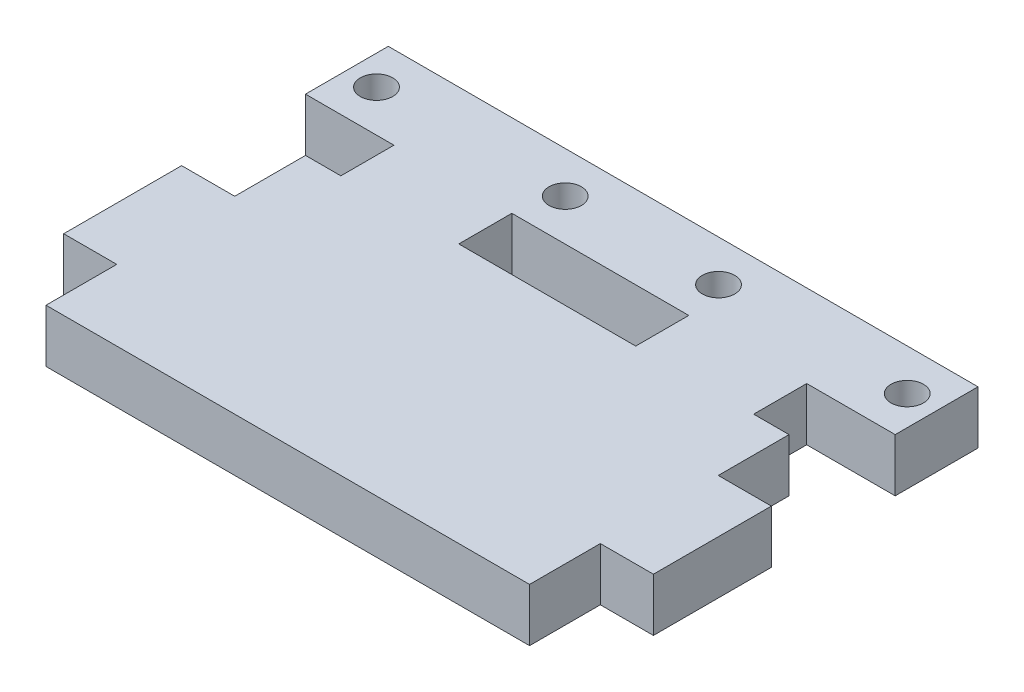
ISO-10303-21;
HEADER;
FILE_DESCRIPTION(('STEP AP214'),'2;1');
FILE_NAME('part.step','',(''),(''),'','','');
FILE_SCHEMA(('AUTOMOTIVE_DESIGN { 1 0 10303 214 1 1 1 1 }'));
ENDSEC;
DATA;
#1=APPLICATION_CONTEXT('core data for automotive mechanical design processes');
#2=APPLICATION_PROTOCOL_DEFINITION('international standard','automotive_design',2000,#1);
#3=PRODUCT_CONTEXT('',#1,'mechanical');
#4=PRODUCT('Part','Part','',(#3));
#5=PRODUCT_RELATED_PRODUCT_CATEGORY('part','',(#4));
#6=PRODUCT_DEFINITION_FORMATION('','',#4);
#7=PRODUCT_DEFINITION_CONTEXT('part definition',#1,'design');
#8=PRODUCT_DEFINITION('design','',#6,#7);
#9=PRODUCT_DEFINITION_SHAPE('','',#8);
#10=(LENGTH_UNIT() NAMED_UNIT(*) SI_UNIT(.MILLI.,.METRE.));
#11=(NAMED_UNIT(*) PLANE_ANGLE_UNIT() SI_UNIT($,.RADIAN.));
#12=(NAMED_UNIT(*) SI_UNIT($,.STERADIAN.) SOLID_ANGLE_UNIT());
#13=UNCERTAINTY_MEASURE_WITH_UNIT(LENGTH_MEASURE(1.E-05),#10,'distance_accuracy_value','');
#14=(GEOMETRIC_REPRESENTATION_CONTEXT(3) GLOBAL_UNCERTAINTY_ASSIGNED_CONTEXT((#13)) GLOBAL_UNIT_ASSIGNED_CONTEXT((#10,
#11,#12)) REPRESENTATION_CONTEXT('',''));
#15=CARTESIAN_POINT('',(0.,0.,0.));
#16=DIRECTION('',(0.,0.,1.));
#17=DIRECTION('',(1.,0.,0.));
#18=AXIS2_PLACEMENT_3D('',#15,#16,#17);
#19=CARTESIAN_POINT('',(0.,9.,47.0425071107844));
#20=DIRECTION('',(0.,0.,-1.));
#21=DIRECTION('',(-1.,0.,0.));
#22=AXIS2_PLACEMENT_3D('',#19,#20,#21);
#23=PLANE('',#22);
#24=DIRECTION('',(1.,0.,0.));
#25=VECTOR('',#24,1.);
#26=CARTESIAN_POINT('',(0.,0.,47.0425071107844));
#27=LINE('',#26,#25);
#28=CARTESIAN_POINT('',(-15.,0.,47.0425071107844));
#29=VERTEX_POINT('',#28);
#30=CARTESIAN_POINT('',(15.,0.,47.0425071107844));
#31=VERTEX_POINT('',#30);
#32=EDGE_CURVE('E235',#29,#31,#27,.T.);
#33=ORIENTED_EDGE('',*,*,#32,.T.);
#34=DIRECTION('',(0.,-1.,0.));
#35=VECTOR('',#34,1.);
#36=CARTESIAN_POINT('',(15.,9.,47.0425071107844));
#37=LINE('',#36,#35);
#38=CARTESIAN_POINT('',(15.,9.,47.0425071107844));
#39=VERTEX_POINT('',#38);
#40=EDGE_CURVE('E11',#39,#31,#37,.T.);
#41=ORIENTED_EDGE('',*,*,#40,.F.);
#42=DIRECTION('',(1.,0.,0.));
#43=VECTOR('',#42,1.);
#44=CARTESIAN_POINT('',(0.,9.,47.0425071107844));
#45=LINE('',#44,#43);
#46=CARTESIAN_POINT('',(-15.,9.,47.0425071107844));
#47=VERTEX_POINT('',#46);
#48=EDGE_CURVE('E210',#47,#39,#45,.T.);
#49=ORIENTED_EDGE('',*,*,#48,.F.);
#50=DIRECTION('',(0.,-1.,0.));
#51=VECTOR('',#50,1.);
#52=CARTESIAN_POINT('',(-15.,9.,47.0425071107844));
#53=LINE('',#52,#51);
#54=EDGE_CURVE('E54',#47,#29,#53,.T.);
#55=ORIENTED_EDGE('',*,*,#54,.T.);
#56=EDGE_LOOP('',(#33,#41,#49,#55));
#57=FACE_BOUND('',#56,.T.);
#58=ADVANCED_FACE('F35',(#57),#23,.F.);
#59=CARTESIAN_POINT('',(15.,9.,0.));
#60=DIRECTION('',(1.,0.,0.));
#61=DIRECTION('',(0.,0.,-1.));
#62=AXIS2_PLACEMENT_3D('',#59,#60,#61);
#63=PLANE('',#62);
#64=DIRECTION('',(0.,0.,1.));
#65=VECTOR('',#64,1.);
#66=CARTESIAN_POINT('',(15.,0.,0.));
#67=LINE('',#66,#65);
#68=CARTESIAN_POINT('',(15.,0.,56.0425071107844));
#69=VERTEX_POINT('',#68);
#70=EDGE_CURVE('E216',#31,#69,#67,.T.);
#71=ORIENTED_EDGE('',*,*,#70,.T.);
#72=DIRECTION('',(0.,-1.,0.));
#73=VECTOR('',#72,1.);
#74=CARTESIAN_POINT('',(15.,9.,56.0425071107844));
#75=LINE('',#74,#73);
#76=CARTESIAN_POINT('',(15.,9.,56.0425071107844));
#77=VERTEX_POINT('',#76);
#78=EDGE_CURVE('E45',#77,#69,#75,.T.);
#79=ORIENTED_EDGE('',*,*,#78,.F.);
#80=DIRECTION('',(0.,0.,1.));
#81=VECTOR('',#80,1.);
#82=CARTESIAN_POINT('',(15.,9.,0.));
#83=LINE('',#82,#81);
#84=EDGE_CURVE('E204',#39,#77,#83,.T.);
#85=ORIENTED_EDGE('',*,*,#84,.F.);
#86=ORIENTED_EDGE('',*,*,#40,.T.);
#87=EDGE_LOOP('',(#71,#79,#85,#86));
#88=FACE_BOUND('',#87,.T.);
#89=ADVANCED_FACE('F215',(#88),#63,.F.);
#90=CARTESIAN_POINT('',(0.,9.,56.0425071107844));
#91=DIRECTION('',(0.,0.,-1.));
#92=DIRECTION('',(-1.,0.,0.));
#93=AXIS2_PLACEMENT_3D('',#90,#91,#92);
#94=PLANE('',#93);
#95=DIRECTION('',(1.,0.,0.));
#96=VECTOR('',#95,1.);
#97=CARTESIAN_POINT('',(0.,0.,56.0425071107844));
#98=LINE('',#97,#96);
#99=CARTESIAN_POINT('',(-15.,0.,56.0425071107844));
#100=VERTEX_POINT('',#99);
#101=EDGE_CURVE('E285',#100,#69,#98,.T.);
#102=ORIENTED_EDGE('',*,*,#101,.F.);
#103=DIRECTION('',(0.,-1.,0.));
#104=VECTOR('',#103,1.);
#105=CARTESIAN_POINT('',(-15.,9.,56.0425071107844));
#106=LINE('',#105,#104);
#107=CARTESIAN_POINT('',(-15.,9.,56.0425071107844));
#108=VERTEX_POINT('',#107);
#109=EDGE_CURVE('E128',#108,#100,#106,.T.);
#110=ORIENTED_EDGE('',*,*,#109,.F.);
#111=DIRECTION('',(1.,0.,0.));
#112=VECTOR('',#111,1.);
#113=CARTESIAN_POINT('',(0.,9.,56.0425071107844));
#114=LINE('',#113,#112);
#115=EDGE_CURVE('E209',#108,#77,#114,.T.);
#116=ORIENTED_EDGE('',*,*,#115,.T.);
#117=ORIENTED_EDGE('',*,*,#78,.T.);
#118=EDGE_LOOP('',(#102,#110,#116,#117));
#119=FACE_BOUND('',#118,.T.);
#120=ADVANCED_FACE('F220',(#119),#94,.T.);
#121=CARTESIAN_POINT('',(35.,9.,0.));
#122=DIRECTION('',(1.,0.,0.));
#123=DIRECTION('',(0.,0.,-1.));
#124=AXIS2_PLACEMENT_3D('',#121,#122,#123);
#125=PLANE('',#124);
#126=DIRECTION('',(0.,0.,1.));
#127=VECTOR('',#126,1.);
#128=CARTESIAN_POINT('',(35.,0.,0.));
#129=LINE('',#128,#127);
#130=CARTESIAN_POINT('',(35.,0.,47.0425071107844));
#131=VERTEX_POINT('',#130);
#132=CARTESIAN_POINT('',(35.,0.,56.0425071107844));
#133=VERTEX_POINT('',#132);
#134=EDGE_CURVE('E227',#131,#133,#129,.T.);
#135=ORIENTED_EDGE('',*,*,#134,.F.);
#136=DIRECTION('',(0.,-1.,0.));
#137=VECTOR('',#136,1.);
#138=CARTESIAN_POINT('',(35.,9.,47.0425071107844));
#139=LINE('',#138,#137);
#140=CARTESIAN_POINT('',(35.,9.,47.0425071107844));
#141=VERTEX_POINT('',#140);
#142=EDGE_CURVE('E39',#141,#131,#139,.T.);
#143=ORIENTED_EDGE('',*,*,#142,.F.);
#144=DIRECTION('',(0.,0.,1.));
#145=VECTOR('',#144,1.);
#146=CARTESIAN_POINT('',(35.,9.,0.));
#147=LINE('',#146,#145);
#148=CARTESIAN_POINT('',(35.,9.,56.0425071107844));
#149=VERTEX_POINT('',#148);
#150=EDGE_CURVE('E290',#141,#149,#147,.T.);
#151=ORIENTED_EDGE('',*,*,#150,.T.);
#152=DIRECTION('',(0.,-1.,0.));
#153=VECTOR('',#152,1.);
#154=CARTESIAN_POINT('',(35.,9.,56.0425071107844));
#155=LINE('',#154,#153);
#156=EDGE_CURVE('E223',#149,#133,#155,.T.);
#157=ORIENTED_EDGE('',*,*,#156,.T.);
#158=EDGE_LOOP('',(#135,#143,#151,#157));
#159=FACE_BOUND('',#158,.T.);
#160=ADVANCED_FACE('F37',(#159),#125,.T.);
#161=CARTESIAN_POINT('',(50.,0.,47.0425071107844));
#162=VERTEX_POINT('',#161);
#163=EDGE_CURVE('E230',#131,#162,#27,.T.);
#164=ORIENTED_EDGE('',*,*,#163,.T.);
#165=DIRECTION('',(0.,-1.,0.));
#166=VECTOR('',#165,1.);
#167=CARTESIAN_POINT('',(50.,9.,47.0425071107844));
#168=LINE('',#167,#166);
#169=CARTESIAN_POINT('',(50.,9.,47.0425071107844));
#170=VERTEX_POINT('',#169);
#171=EDGE_CURVE('E331',#170,#162,#168,.T.);
#172=ORIENTED_EDGE('',*,*,#171,.F.);
#173=EDGE_CURVE('E339',#141,#170,#45,.T.);
#174=ORIENTED_EDGE('',*,*,#173,.F.);
#175=ORIENTED_EDGE('',*,*,#142,.T.);
#176=EDGE_LOOP('',(#164,#172,#174,#175));
#177=FACE_BOUND('',#176,.T.);
#178=ADVANCED_FACE('F338',(#177),#23,.F.);
#179=CARTESIAN_POINT('',(50.,9.,0.));
#180=DIRECTION('',(1.,0.,0.));
#181=DIRECTION('',(0.,0.,-1.));
#182=AXIS2_PLACEMENT_3D('',#179,#180,#181);
#183=PLANE('',#182);
#184=DIRECTION('',(0.,0.,1.));
#185=VECTOR('',#184,1.);
#186=CARTESIAN_POINT('',(50.,0.,0.));
#187=LINE('',#186,#185);
#188=CARTESIAN_POINT('',(50.,0.,33.));
#189=VERTEX_POINT('',#188);
#190=EDGE_CURVE('E234',#189,#162,#187,.T.);
#191=ORIENTED_EDGE('',*,*,#190,.F.);
#192=DIRECTION('',(0.,-1.,0.));
#193=VECTOR('',#192,1.);
#194=CARTESIAN_POINT('',(50.,9.,33.));
#195=LINE('',#194,#193);
#196=CARTESIAN_POINT('',(50.,9.,33.));
#197=VERTEX_POINT('',#196);
#198=EDGE_CURVE('E330',#197,#189,#195,.T.);
#199=ORIENTED_EDGE('',*,*,#198,.F.);
#200=DIRECTION('',(0.,0.,1.));
#201=VECTOR('',#200,1.);
#202=CARTESIAN_POINT('',(50.,9.,0.));
#203=LINE('',#202,#201);
#204=EDGE_CURVE('E478',#197,#170,#203,.T.);
#205=ORIENTED_EDGE('',*,*,#204,.T.);
#206=ORIENTED_EDGE('',*,*,#171,.T.);
#207=EDGE_LOOP('',(#191,#199,#205,#206));
#208=FACE_BOUND('',#207,.T.);
#209=ADVANCED_FACE('F450',(#208),#183,.T.);
#210=CARTESIAN_POINT('',(0.,9.,33.));
#211=DIRECTION('',(0.,0.,-1.));
#212=DIRECTION('',(-1.,0.,0.));
#213=AXIS2_PLACEMENT_3D('',#210,#211,#212);
#214=PLANE('',#213);
#215=DIRECTION('',(1.,0.,0.));
#216=VECTOR('',#215,1.);
#217=CARTESIAN_POINT('',(0.,0.,33.));
#218=LINE('',#217,#216);
#219=CARTESIAN_POINT('',(-50.,0.,33.));
#220=VERTEX_POINT('',#219);
#221=EDGE_CURVE('E239',#220,#189,#218,.T.);
#222=ORIENTED_EDGE('',*,*,#221,.F.);
#223=DIRECTION('',(0.,-1.,0.));
#224=VECTOR('',#223,1.);
#225=CARTESIAN_POINT('',(-50.,9.,33.));
#226=LINE('',#225,#224);
#227=CARTESIAN_POINT('',(-50.,9.,33.));
#228=VERTEX_POINT('',#227);
#229=EDGE_CURVE('E328',#228,#220,#226,.T.);
#230=ORIENTED_EDGE('',*,*,#229,.F.);
#231=DIRECTION('',(1.,0.,0.));
#232=VECTOR('',#231,1.);
#233=CARTESIAN_POINT('',(0.,9.,33.));
#234=LINE('',#233,#232);
#235=EDGE_CURVE('E474',#228,#197,#234,.T.);
#236=ORIENTED_EDGE('',*,*,#235,.T.);
#237=ORIENTED_EDGE('',*,*,#198,.T.);
#238=EDGE_LOOP('',(#222,#230,#236,#237));
#239=FACE_BOUND('',#238,.T.);
#240=ADVANCED_FACE('F458',(#239),#214,.T.);
#241=CARTESIAN_POINT('',(-50.,9.,0.));
#242=DIRECTION('',(-1.,0.,0.));
#243=DIRECTION('',(0.,0.,1.));
#244=AXIS2_PLACEMENT_3D('',#241,#242,#243);
#245=PLANE('',#244);
#246=DIRECTION('',(0.,0.,-1.));
#247=VECTOR('',#246,1.);
#248=CARTESIAN_POINT('',(-50.,0.,0.));
#249=LINE('',#248,#247);
#250=CARTESIAN_POINT('',(-50.,0.,47.0425071107844));
#251=VERTEX_POINT('',#250);
#252=EDGE_CURVE('E242',#251,#220,#249,.T.);
#253=ORIENTED_EDGE('',*,*,#252,.F.);
#254=DIRECTION('',(0.,-1.,0.));
#255=VECTOR('',#254,1.);
#256=CARTESIAN_POINT('',(-50.,9.,47.0425071107844));
#257=LINE('',#256,#255);
#258=CARTESIAN_POINT('',(-50.,9.,47.0425071107844));
#259=VERTEX_POINT('',#258);
#260=EDGE_CURVE('E326',#259,#251,#257,.T.);
#261=ORIENTED_EDGE('',*,*,#260,.F.);
#262=DIRECTION('',(0.,0.,-1.));
#263=VECTOR('',#262,1.);
#264=CARTESIAN_POINT('',(-50.,9.,0.));
#265=LINE('',#264,#263);
#266=EDGE_CURVE('E477',#259,#228,#265,.T.);
#267=ORIENTED_EDGE('',*,*,#266,.T.);
#268=ORIENTED_EDGE('',*,*,#229,.T.);
#269=EDGE_LOOP('',(#253,#261,#267,#268));
#270=FACE_BOUND('',#269,.T.);
#271=ADVANCED_FACE('F452',(#270),#245,.T.);
#272=CARTESIAN_POINT('',(-35.,0.,47.0425071107844));
#273=VERTEX_POINT('',#272);
#274=EDGE_CURVE('E236',#251,#273,#27,.T.);
#275=ORIENTED_EDGE('',*,*,#274,.T.);
#276=DIRECTION('',(0.,-1.,0.));
#277=VECTOR('',#276,1.);
#278=CARTESIAN_POINT('',(-35.,9.,47.0425071107844));
#279=LINE('',#278,#277);
#280=CARTESIAN_POINT('',(-35.,9.,47.0425071107844));
#281=VERTEX_POINT('',#280);
#282=EDGE_CURVE('E323',#281,#273,#279,.T.);
#283=ORIENTED_EDGE('',*,*,#282,.F.);
#284=EDGE_CURVE('E426',#259,#281,#45,.T.);
#285=ORIENTED_EDGE('',*,*,#284,.F.);
#286=ORIENTED_EDGE('',*,*,#260,.T.);
#287=EDGE_LOOP('',(#275,#283,#285,#286));
#288=FACE_BOUND('',#287,.T.);
#289=ADVANCED_FACE('F425',(#288),#23,.F.);
#290=CARTESIAN_POINT('',(-35.,9.,0.));
#291=DIRECTION('',(1.,0.,0.));
#292=DIRECTION('',(0.,0.,-1.));
#293=AXIS2_PLACEMENT_3D('',#290,#291,#292);
#294=PLANE('',#293);
#295=DIRECTION('',(0.,0.,1.));
#296=VECTOR('',#295,1.);
#297=CARTESIAN_POINT('',(-35.,0.,0.));
#298=LINE('',#297,#296);
#299=CARTESIAN_POINT('',(-35.,0.,56.0425071107844));
#300=VERTEX_POINT('',#299);
#301=EDGE_CURVE('E245',#273,#300,#298,.T.);
#302=ORIENTED_EDGE('',*,*,#301,.T.);
#303=DIRECTION('',(0.,-1.,0.));
#304=VECTOR('',#303,1.);
#305=CARTESIAN_POINT('',(-35.,9.,56.0425071107844));
#306=LINE('',#305,#304);
#307=CARTESIAN_POINT('',(-35.,9.,56.0425071107844));
#308=VERTEX_POINT('',#307);
#309=EDGE_CURVE('E321',#308,#300,#306,.T.);
#310=ORIENTED_EDGE('',*,*,#309,.F.);
#311=DIRECTION('',(0.,0.,1.));
#312=VECTOR('',#311,1.);
#313=CARTESIAN_POINT('',(-35.,9.,0.));
#314=LINE('',#313,#312);
#315=EDGE_CURVE('E422',#281,#308,#314,.T.);
#316=ORIENTED_EDGE('',*,*,#315,.F.);
#317=ORIENTED_EDGE('',*,*,#282,.T.);
#318=EDGE_LOOP('',(#302,#310,#316,#317));
#319=FACE_BOUND('',#318,.T.);
#320=ADVANCED_FACE('F420',(#319),#294,.F.);
#321=CARTESIAN_POINT('',(0.,9.,56.0425071107844));
#322=DIRECTION('',(0.,0.,-1.));
#323=DIRECTION('',(-1.,0.,0.));
#324=AXIS2_PLACEMENT_3D('',#321,#322,#323);
#325=PLANE('',#324);
#326=DIRECTION('',(1.,0.,0.));
#327=VECTOR('',#326,1.);
#328=CARTESIAN_POINT('',(0.,0.,56.0425071107844));
#329=LINE('',#328,#327);
#330=CARTESIAN_POINT('',(-41.,0.,56.0425071107844));
#331=VERTEX_POINT('',#330);
#332=EDGE_CURVE('E248',#331,#300,#329,.T.);
#333=ORIENTED_EDGE('',*,*,#332,.F.);
#334=DIRECTION('',(0.,-1.,0.));
#335=VECTOR('',#334,1.);
#336=CARTESIAN_POINT('',(-41.,9.,56.0425071107844));
#337=LINE('',#336,#335);
#338=CARTESIAN_POINT('',(-41.,9.,56.0425071107844));
#339=VERTEX_POINT('',#338);
#340=EDGE_CURVE('E319',#339,#331,#337,.T.);
#341=ORIENTED_EDGE('',*,*,#340,.F.);
#342=DIRECTION('',(1.,0.,0.));
#343=VECTOR('',#342,1.);
#344=CARTESIAN_POINT('',(0.,9.,56.0425071107844));
#345=LINE('',#344,#343);
#346=EDGE_CURVE('E417',#339,#308,#345,.T.);
#347=ORIENTED_EDGE('',*,*,#346,.T.);
#348=ORIENTED_EDGE('',*,*,#309,.T.);
#349=EDGE_LOOP('',(#333,#341,#347,#348));
#350=FACE_BOUND('',#349,.T.);
#351=ADVANCED_FACE('F413',(#350),#325,.T.);
#352=CARTESIAN_POINT('',(-41.,9.,0.));
#353=DIRECTION('',(-1.,0.,0.));
#354=DIRECTION('',(0.,0.,1.));
#355=AXIS2_PLACEMENT_3D('',#352,#353,#354);
#356=PLANE('',#355);
#357=DIRECTION('',(0.,0.,-1.));
#358=VECTOR('',#357,1.);
#359=CARTESIAN_POINT('',(-41.,0.,0.));
#360=LINE('',#359,#358);
#361=CARTESIAN_POINT('',(-41.,0.,68.0425071107844));
#362=VERTEX_POINT('',#361);
#363=EDGE_CURVE('E251',#362,#331,#360,.T.);
#364=ORIENTED_EDGE('',*,*,#363,.F.);
#365=DIRECTION('',(0.,-1.,0.));
#366=VECTOR('',#365,1.);
#367=CARTESIAN_POINT('',(-41.,9.,68.0425071107844));
#368=LINE('',#367,#366);
#369=CARTESIAN_POINT('',(-41.,9.,68.0425071107844));
#370=VERTEX_POINT('',#369);
#371=EDGE_CURVE('E317',#370,#362,#368,.T.);
#372=ORIENTED_EDGE('',*,*,#371,.F.);
#373=DIRECTION('',(0.,0.,-1.));
#374=VECTOR('',#373,1.);
#375=CARTESIAN_POINT('',(-41.,9.,0.));
#376=LINE('',#375,#374);
#377=EDGE_CURVE('E486',#370,#339,#376,.T.);
#378=ORIENTED_EDGE('',*,*,#377,.T.);
#379=ORIENTED_EDGE('',*,*,#340,.T.);
#380=EDGE_LOOP('',(#364,#372,#378,#379));
#381=FACE_BOUND('',#380,.T.);
#382=ADVANCED_FACE('F408',(#381),#356,.T.);
#383=CARTESIAN_POINT('',(0.,9.,68.0425071107844));
#384=DIRECTION('',(0.,0.,-1.));
#385=DIRECTION('',(-1.,0.,0.));
#386=AXIS2_PLACEMENT_3D('',#383,#384,#385);
#387=PLANE('',#386);
#388=DIRECTION('',(1.,0.,0.));
#389=VECTOR('',#388,1.);
#390=CARTESIAN_POINT('',(0.,0.,68.0425071107844));
#391=LINE('',#390,#389);
#392=CARTESIAN_POINT('',(-50.,0.,68.0425071107844));
#393=VERTEX_POINT('',#392);
#394=EDGE_CURVE('E254',#393,#362,#391,.T.);
#395=ORIENTED_EDGE('',*,*,#394,.F.);
#396=DIRECTION('',(0.,-1.,0.));
#397=VECTOR('',#396,1.);
#398=CARTESIAN_POINT('',(-50.,9.,68.0425071107844));
#399=LINE('',#398,#397);
#400=CARTESIAN_POINT('',(-50.,9.,68.0425071107844));
#401=VERTEX_POINT('',#400);
#402=EDGE_CURVE('E315',#401,#393,#399,.T.);
#403=ORIENTED_EDGE('',*,*,#402,.F.);
#404=DIRECTION('',(1.,0.,0.));
#405=VECTOR('',#404,1.);
#406=CARTESIAN_POINT('',(0.,9.,68.0425071107844));
#407=LINE('',#406,#405);
#408=EDGE_CURVE('E404',#401,#370,#407,.T.);
#409=ORIENTED_EDGE('',*,*,#408,.T.);
#410=ORIENTED_EDGE('',*,*,#371,.T.);
#411=EDGE_LOOP('',(#395,#403,#409,#410));
#412=FACE_BOUND('',#411,.T.);
#413=ADVANCED_FACE('F401',(#412),#387,.T.);
#414=CARTESIAN_POINT('',(-50.,9.,0.));
#415=DIRECTION('',(1.,0.,0.));
#416=DIRECTION('',(0.,0.,-1.));
#417=AXIS2_PLACEMENT_3D('',#414,#415,#416);
#418=PLANE('',#417);
#419=DIRECTION('',(0.,0.,1.));
#420=VECTOR('',#419,1.);
#421=CARTESIAN_POINT('',(-50.,0.,0.));
#422=LINE('',#421,#420);
#423=CARTESIAN_POINT('',(-50.,0.,88.0425071107844));
#424=VERTEX_POINT('',#423);
#425=EDGE_CURVE('E257',#393,#424,#422,.T.);
#426=ORIENTED_EDGE('',*,*,#425,.T.);
#427=DIRECTION('',(0.,-1.,0.));
#428=VECTOR('',#427,1.);
#429=CARTESIAN_POINT('',(-50.,9.,88.0425071107844));
#430=LINE('',#429,#428);
#431=CARTESIAN_POINT('',(-50.,9.,88.0425071107844));
#432=VERTEX_POINT('',#431);
#433=EDGE_CURVE('E312',#432,#424,#430,.T.);
#434=ORIENTED_EDGE('',*,*,#433,.F.);
#435=DIRECTION('',(0.,0.,1.));
#436=VECTOR('',#435,1.);
#437=CARTESIAN_POINT('',(-50.,9.,0.));
#438=LINE('',#437,#436);
#439=EDGE_CURVE('E397',#401,#432,#438,.T.);
#440=ORIENTED_EDGE('',*,*,#439,.F.);
#441=ORIENTED_EDGE('',*,*,#402,.T.);
#442=EDGE_LOOP('',(#426,#434,#440,#441));
#443=FACE_BOUND('',#442,.T.);
#444=ADVANCED_FACE('F396',(#443),#418,.F.);
#445=CARTESIAN_POINT('',(1.35759470194607E-13,9.,88.0425071107843));
#446=DIRECTION('',(0.,0.,-1.));
#447=DIRECTION('',(-1.,0.,0.));
#448=AXIS2_PLACEMENT_3D('',#445,#446,#447);
#449=PLANE('',#448);
#450=DIRECTION('',(1.,0.,0.));
#451=VECTOR('',#450,1.);
#452=CARTESIAN_POINT('',(1.35759470194607E-13,0.,88.0425071107843));
#453=LINE('',#452,#451);
#454=CARTESIAN_POINT('',(-41.,0.,88.0425071107844));
#455=VERTEX_POINT('',#454);
#456=EDGE_CURVE('E259',#424,#455,#453,.T.);
#457=ORIENTED_EDGE('',*,*,#456,.T.);
#458=DIRECTION('',(0.,-1.,0.));
#459=VECTOR('',#458,1.);
#460=CARTESIAN_POINT('',(-41.,9.,88.0425071107844));
#461=LINE('',#460,#459);
#462=CARTESIAN_POINT('',(-41.,9.,88.0425071107844));
#463=VERTEX_POINT('',#462);
#464=EDGE_CURVE('E309',#463,#455,#461,.T.);
#465=ORIENTED_EDGE('',*,*,#464,.F.);
#466=DIRECTION('',(1.,0.,0.));
#467=VECTOR('',#466,1.);
#468=CARTESIAN_POINT('',(1.35759470194607E-13,9.,88.0425071107843));
#469=LINE('',#468,#467);
#470=EDGE_CURVE('E392',#432,#463,#469,.T.);
#471=ORIENTED_EDGE('',*,*,#470,.F.);
#472=ORIENTED_EDGE('',*,*,#433,.T.);
#473=EDGE_LOOP('',(#457,#465,#471,#472));
#474=FACE_BOUND('',#473,.T.);
#475=ADVANCED_FACE('F391',(#474),#449,.F.);
#476=CARTESIAN_POINT('',(-41.,9.,0.));
#477=DIRECTION('',(1.,0.,0.));
#478=DIRECTION('',(0.,0.,-1.));
#479=AXIS2_PLACEMENT_3D('',#476,#477,#478);
#480=PLANE('',#479);
#481=DIRECTION('',(0.,0.,1.));
#482=VECTOR('',#481,1.);
#483=CARTESIAN_POINT('',(-41.,0.,0.));
#484=LINE('',#483,#482);
#485=CARTESIAN_POINT('',(-41.,0.,100.042507110784));
#486=VERTEX_POINT('',#485);
#487=EDGE_CURVE('E261',#455,#486,#484,.T.);
#488=ORIENTED_EDGE('',*,*,#487,.T.);
#489=DIRECTION('',(0.,-1.,0.));
#490=VECTOR('',#489,1.);
#491=CARTESIAN_POINT('',(-41.,9.,100.042507110784));
#492=LINE('',#491,#490);
#493=CARTESIAN_POINT('',(-41.,9.,100.042507110784));
#494=VERTEX_POINT('',#493);
#495=EDGE_CURVE('E306',#494,#486,#492,.T.);
#496=ORIENTED_EDGE('',*,*,#495,.F.);
#497=DIRECTION('',(0.,0.,1.));
#498=VECTOR('',#497,1.);
#499=CARTESIAN_POINT('',(-41.,9.,0.));
#500=LINE('',#499,#498);
#501=EDGE_CURVE('E388',#463,#494,#500,.T.);
#502=ORIENTED_EDGE('',*,*,#501,.F.);
#503=ORIENTED_EDGE('',*,*,#464,.T.);
#504=EDGE_LOOP('',(#488,#496,#502,#503));
#505=FACE_BOUND('',#504,.T.);
#506=ADVANCED_FACE('F385',(#505),#480,.F.);
#507=CARTESIAN_POINT('',(0.,9.,100.042507110784));
#508=DIRECTION('',(0.,0.,-1.));
#509=DIRECTION('',(-1.,0.,0.));
#510=AXIS2_PLACEMENT_3D('',#507,#508,#509);
#511=PLANE('',#510);
#512=DIRECTION('',(1.,0.,0.));
#513=VECTOR('',#512,1.);
#514=CARTESIAN_POINT('',(0.,0.,100.042507110784));
#515=LINE('',#514,#513);
#516=CARTESIAN_POINT('',(41.,0.,100.042507110784));
#517=VERTEX_POINT('',#516);
#518=EDGE_CURVE('E263',#486,#517,#515,.T.);
#519=ORIENTED_EDGE('',*,*,#518,.T.);
#520=DIRECTION('',(0.,-1.,0.));
#521=VECTOR('',#520,1.);
#522=CARTESIAN_POINT('',(41.,9.,100.042507110784));
#523=LINE('',#522,#521);
#524=CARTESIAN_POINT('',(41.,9.,100.042507110784));
#525=VERTEX_POINT('',#524);
#526=EDGE_CURVE('E304',#525,#517,#523,.T.);
#527=ORIENTED_EDGE('',*,*,#526,.F.);
#528=DIRECTION('',(1.,0.,0.));
#529=VECTOR('',#528,1.);
#530=CARTESIAN_POINT('',(0.,9.,100.042507110784));
#531=LINE('',#530,#529);
#532=EDGE_CURVE('E492',#494,#525,#531,.T.);
#533=ORIENTED_EDGE('',*,*,#532,.F.);
#534=ORIENTED_EDGE('',*,*,#495,.T.);
#535=EDGE_LOOP('',(#519,#527,#533,#534));
#536=FACE_BOUND('',#535,.T.);
#537=ADVANCED_FACE('F379',(#536),#511,.F.);
#538=CARTESIAN_POINT('',(41.,9.,0.));
#539=DIRECTION('',(1.,0.,0.));
#540=DIRECTION('',(0.,0.,-1.));
#541=AXIS2_PLACEMENT_3D('',#538,#539,#540);
#542=PLANE('',#541);
#543=DIRECTION('',(0.,0.,1.));
#544=VECTOR('',#543,1.);
#545=CARTESIAN_POINT('',(41.,0.,0.));
#546=LINE('',#545,#544);
#547=CARTESIAN_POINT('',(41.,0.,88.0425071107844));
#548=VERTEX_POINT('',#547);
#549=EDGE_CURVE('E266',#548,#517,#546,.T.);
#550=ORIENTED_EDGE('',*,*,#549,.F.);
#551=DIRECTION('',(0.,-1.,0.));
#552=VECTOR('',#551,1.);
#553=CARTESIAN_POINT('',(41.,9.,88.0425071107844));
#554=LINE('',#553,#552);
#555=CARTESIAN_POINT('',(41.,9.,88.0425071107844));
#556=VERTEX_POINT('',#555);
#557=EDGE_CURVE('E302',#556,#548,#554,.T.);
#558=ORIENTED_EDGE('',*,*,#557,.F.);
#559=DIRECTION('',(0.,0.,1.));
#560=VECTOR('',#559,1.);
#561=CARTESIAN_POINT('',(41.,9.,0.));
#562=LINE('',#561,#560);
#563=EDGE_CURVE('E376',#556,#525,#562,.T.);
#564=ORIENTED_EDGE('',*,*,#563,.T.);
#565=ORIENTED_EDGE('',*,*,#526,.T.);
#566=EDGE_LOOP('',(#550,#558,#564,#565));
#567=FACE_BOUND('',#566,.T.);
#568=ADVANCED_FACE('F371',(#567),#542,.T.);
#569=CARTESIAN_POINT('',(0.,9.,88.0425071107844));
#570=DIRECTION('',(0.,0.,-1.));
#571=DIRECTION('',(-1.,0.,0.));
#572=AXIS2_PLACEMENT_3D('',#569,#570,#571);
#573=PLANE('',#572);
#574=DIRECTION('',(1.,0.,0.));
#575=VECTOR('',#574,1.);
#576=CARTESIAN_POINT('',(0.,0.,88.0425071107844));
#577=LINE('',#576,#575);
#578=CARTESIAN_POINT('',(50.,0.,88.0425071107844));
#579=VERTEX_POINT('',#578);
#580=EDGE_CURVE('E269',#548,#579,#577,.T.);
#581=ORIENTED_EDGE('',*,*,#580,.T.);
#582=DIRECTION('',(0.,-1.,0.));
#583=VECTOR('',#582,1.);
#584=CARTESIAN_POINT('',(50.,9.,88.0425071107844));
#585=LINE('',#584,#583);
#586=CARTESIAN_POINT('',(50.,9.,88.0425071107844));
#587=VERTEX_POINT('',#586);
#588=EDGE_CURVE('E300',#587,#579,#585,.T.);
#589=ORIENTED_EDGE('',*,*,#588,.F.);
#590=DIRECTION('',(1.,0.,0.));
#591=VECTOR('',#590,1.);
#592=CARTESIAN_POINT('',(0.,9.,88.0425071107844));
#593=LINE('',#592,#591);
#594=EDGE_CURVE('E495',#556,#587,#593,.T.);
#595=ORIENTED_EDGE('',*,*,#594,.F.);
#596=ORIENTED_EDGE('',*,*,#557,.T.);
#597=EDGE_LOOP('',(#581,#589,#595,#596));
#598=FACE_BOUND('',#597,.T.);
#599=ADVANCED_FACE('F550',(#598),#573,.F.);
#600=CARTESIAN_POINT('',(50.0000000000001,9.,0.));
#601=DIRECTION('',(1.,0.,0.));
#602=DIRECTION('',(0.,0.,-1.));
#603=AXIS2_PLACEMENT_3D('',#600,#601,#602);
#604=PLANE('',#603);
#605=DIRECTION('',(0.,0.,1.));
#606=VECTOR('',#605,1.);
#607=CARTESIAN_POINT('',(50.0000000000001,0.,0.));
#608=LINE('',#607,#606);
#609=CARTESIAN_POINT('',(50.,0.,68.0425071107844));
#610=VERTEX_POINT('',#609);
#611=EDGE_CURVE('E272',#610,#579,#608,.T.);
#612=ORIENTED_EDGE('',*,*,#611,.F.);
#613=DIRECTION('',(0.,-1.,0.));
#614=VECTOR('',#613,1.);
#615=CARTESIAN_POINT('',(50.,9.,68.0425071107844));
#616=LINE('',#615,#614);
#617=CARTESIAN_POINT('',(50.,9.,68.0425071107844));
#618=VERTEX_POINT('',#617);
#619=EDGE_CURVE('E298',#618,#610,#616,.T.);
#620=ORIENTED_EDGE('',*,*,#619,.F.);
#621=DIRECTION('',(0.,0.,1.));
#622=VECTOR('',#621,1.);
#623=CARTESIAN_POINT('',(50.0000000000001,9.,0.));
#624=LINE('',#623,#622);
#625=EDGE_CURVE('E497',#618,#587,#624,.T.);
#626=ORIENTED_EDGE('',*,*,#625,.T.);
#627=ORIENTED_EDGE('',*,*,#588,.T.);
#628=EDGE_LOOP('',(#612,#620,#626,#627));
#629=FACE_BOUND('',#628,.T.);
#630=ADVANCED_FACE('F364',(#629),#604,.T.);
#631=CARTESIAN_POINT('',(0.,9.,68.0425071107844));
#632=DIRECTION('',(0.,0.,-1.));
#633=DIRECTION('',(-1.,0.,0.));
#634=AXIS2_PLACEMENT_3D('',#631,#632,#633);
#635=PLANE('',#634);
#636=DIRECTION('',(1.,0.,0.));
#637=VECTOR('',#636,1.);
#638=CARTESIAN_POINT('',(0.,0.,68.0425071107844));
#639=LINE('',#638,#637);
#640=CARTESIAN_POINT('',(41.,0.,68.0425071107844));
#641=VERTEX_POINT('',#640);
#642=EDGE_CURVE('E275',#641,#610,#639,.T.);
#643=ORIENTED_EDGE('',*,*,#642,.F.);
#644=DIRECTION('',(0.,-1.,0.));
#645=VECTOR('',#644,1.);
#646=CARTESIAN_POINT('',(41.,9.,68.0425071107844));
#647=LINE('',#646,#645);
#648=CARTESIAN_POINT('',(41.,9.,68.0425071107844));
#649=VERTEX_POINT('',#648);
#650=EDGE_CURVE('E296',#649,#641,#647,.T.);
#651=ORIENTED_EDGE('',*,*,#650,.F.);
#652=DIRECTION('',(1.,0.,0.));
#653=VECTOR('',#652,1.);
#654=CARTESIAN_POINT('',(0.,9.,68.0425071107844));
#655=LINE('',#654,#653);
#656=EDGE_CURVE('E360',#649,#618,#655,.T.);
#657=ORIENTED_EDGE('',*,*,#656,.T.);
#658=ORIENTED_EDGE('',*,*,#619,.T.);
#659=EDGE_LOOP('',(#643,#651,#657,#658));
#660=FACE_BOUND('',#659,.T.);
#661=ADVANCED_FACE('F355',(#660),#635,.T.);
#662=CARTESIAN_POINT('',(41.,9.,0.));
#663=DIRECTION('',(-1.,0.,0.));
#664=DIRECTION('',(0.,0.,1.));
#665=AXIS2_PLACEMENT_3D('',#662,#663,#664);
#666=PLANE('',#665);
#667=DIRECTION('',(0.,0.,-1.));
#668=VECTOR('',#667,1.);
#669=CARTESIAN_POINT('',(41.,0.,0.));
#670=LINE('',#669,#668);
#671=CARTESIAN_POINT('',(41.,0.,56.0425071107844));
#672=VERTEX_POINT('',#671);
#673=EDGE_CURVE('E278',#641,#672,#670,.T.);
#674=ORIENTED_EDGE('',*,*,#673,.T.);
#675=DIRECTION('',(0.,-1.,0.));
#676=VECTOR('',#675,1.);
#677=CARTESIAN_POINT('',(41.,9.,56.0425071107844));
#678=LINE('',#677,#676);
#679=CARTESIAN_POINT('',(41.,9.,56.0425071107844));
#680=VERTEX_POINT('',#679);
#681=EDGE_CURVE('E294',#680,#672,#678,.T.);
#682=ORIENTED_EDGE('',*,*,#681,.F.);
#683=DIRECTION('',(0.,0.,-1.));
#684=VECTOR('',#683,1.);
#685=CARTESIAN_POINT('',(41.,9.,0.));
#686=LINE('',#685,#684);
#687=EDGE_CURVE('E500',#649,#680,#686,.T.);
#688=ORIENTED_EDGE('',*,*,#687,.F.);
#689=ORIENTED_EDGE('',*,*,#650,.T.);
#690=EDGE_LOOP('',(#674,#682,#688,#689));
#691=FACE_BOUND('',#690,.T.);
#692=ADVANCED_FACE('F439',(#691),#666,.F.);
#693=CARTESIAN_POINT('',(0.,9.,56.0425071107844));
#694=DIRECTION('',(0.,0.,-1.));
#695=DIRECTION('',(-1.,0.,0.));
#696=AXIS2_PLACEMENT_3D('',#693,#694,#695);
#697=PLANE('',#696);
#698=DIRECTION('',(1.,0.,0.));
#699=VECTOR('',#698,1.);
#700=CARTESIAN_POINT('',(0.,0.,56.0425071107844));
#701=LINE('',#700,#699);
#702=EDGE_CURVE('E281',#133,#672,#701,.T.);
#703=ORIENTED_EDGE('',*,*,#702,.F.);
#704=ORIENTED_EDGE('',*,*,#156,.F.);
#705=DIRECTION('',(1.,0.,0.));
#706=VECTOR('',#705,1.);
#707=CARTESIAN_POINT('',(0.,9.,56.0425071107844));
#708=LINE('',#707,#706);
#709=EDGE_CURVE('E349',#149,#680,#708,.T.);
#710=ORIENTED_EDGE('',*,*,#709,.T.);
#711=ORIENTED_EDGE('',*,*,#681,.T.);
#712=EDGE_LOOP('',(#703,#704,#710,#711));
#713=FACE_BOUND('',#712,.T.);
#714=ADVANCED_FACE('F348',(#713),#697,.T.);
#715=CARTESIAN_POINT('',(-15.,9.,0.));
#716=DIRECTION('',(1.,0.,0.));
#717=DIRECTION('',(0.,0.,-1.));
#718=AXIS2_PLACEMENT_3D('',#715,#716,#717);
#719=PLANE('',#718);
#720=DIRECTION('',(0.,0.,1.));
#721=VECTOR('',#720,1.);
#722=CARTESIAN_POINT('',(-15.,0.,0.));
#723=LINE('',#722,#721);
#724=EDGE_CURVE('E287',#29,#100,#723,.T.);
#725=ORIENTED_EDGE('',*,*,#724,.F.);
#726=ORIENTED_EDGE('',*,*,#54,.F.);
#727=DIRECTION('',(0.,0.,1.));
#728=VECTOR('',#727,1.);
#729=CARTESIAN_POINT('',(-15.,9.,0.));
#730=LINE('',#729,#728);
#731=EDGE_CURVE('E221',#47,#108,#730,.T.);
#732=ORIENTED_EDGE('',*,*,#731,.T.);
#733=ORIENTED_EDGE('',*,*,#109,.T.);
#734=EDGE_LOOP('',(#725,#726,#732,#733));
#735=FACE_BOUND('',#734,.T.);
#736=ADVANCED_FACE('F429',(#735),#719,.T.);
#737=CARTESIAN_POINT('',(0.,9.,0.));
#738=DIRECTION('',(0.,1.,0.));
#739=DIRECTION('',(0.,0.,1.));
#740=AXIS2_PLACEMENT_3D('',#737,#738,#739);
#741=PLANE('',#740);
#742=CARTESIAN_POINT('',(-13.,9.,40.));
#743=DIRECTION('',(0.,1.,0.));
#744=DIRECTION('',(0.,0.,1.));
#745=AXIS2_PLACEMENT_3D('',#742,#743,#744);
#746=CIRCLE('',#745,2.75);
#747=CARTESIAN_POINT('',(-13.,9.,42.75));
#748=VERTEX_POINT('',#747);
#749=EDGE_CURVE('E521',#748,#748,#746,.T.);
#750=ORIENTED_EDGE('',*,*,#749,.F.);
#751=EDGE_LOOP('',(#750));
#752=FACE_BOUND('',#751,.T.);
#753=CARTESIAN_POINT('',(13.,9.,40.));
#754=DIRECTION('',(0.,1.,0.));
#755=DIRECTION('',(0.,0.,-1.));
#756=AXIS2_PLACEMENT_3D('',#753,#754,#755);
#757=CIRCLE('',#756,2.75);
#758=CARTESIAN_POINT('',(13.,9.,37.25));
#759=VERTEX_POINT('',#758);
#760=EDGE_CURVE('E515',#759,#759,#757,.T.);
#761=ORIENTED_EDGE('',*,*,#760,.F.);
#762=EDGE_LOOP('',(#761));
#763=FACE_BOUND('',#762,.T.);
#764=CARTESIAN_POINT('',(45.,9.,40.));
#765=DIRECTION('',(0.,1.,0.));
#766=DIRECTION('',(0.,0.,-1.));
#767=AXIS2_PLACEMENT_3D('',#764,#765,#766);
#768=CIRCLE('',#767,2.75);
#769=CARTESIAN_POINT('',(45.,9.,37.25));
#770=VERTEX_POINT('',#769);
#771=EDGE_CURVE('E509',#770,#770,#768,.T.);
#772=ORIENTED_EDGE('',*,*,#771,.F.);
#773=EDGE_LOOP('',(#772));
#774=FACE_BOUND('',#773,.T.);
#775=CARTESIAN_POINT('',(-45.,9.,40.));
#776=DIRECTION('',(0.,1.,0.));
#777=DIRECTION('',(0.,0.,1.));
#778=AXIS2_PLACEMENT_3D('',#775,#776,#777);
#779=CIRCLE('',#778,2.75);
#780=CARTESIAN_POINT('',(-45.,9.,42.75));
#781=VERTEX_POINT('',#780);
#782=EDGE_CURVE('E503',#781,#781,#779,.T.);
#783=ORIENTED_EDGE('',*,*,#782,.F.);
#784=EDGE_LOOP('',(#783));
#785=FACE_BOUND('',#784,.T.);
#786=ORIENTED_EDGE('',*,*,#150,.F.);
#787=ORIENTED_EDGE('',*,*,#173,.T.);
#788=ORIENTED_EDGE('',*,*,#204,.F.);
#789=ORIENTED_EDGE('',*,*,#235,.F.);
#790=ORIENTED_EDGE('',*,*,#266,.F.);
#791=ORIENTED_EDGE('',*,*,#284,.T.);
#792=ORIENTED_EDGE('',*,*,#315,.T.);
#793=ORIENTED_EDGE('',*,*,#346,.F.);
#794=ORIENTED_EDGE('',*,*,#377,.F.);
#795=ORIENTED_EDGE('',*,*,#408,.F.);
#796=ORIENTED_EDGE('',*,*,#439,.T.);
#797=ORIENTED_EDGE('',*,*,#470,.T.);
#798=ORIENTED_EDGE('',*,*,#501,.T.);
#799=ORIENTED_EDGE('',*,*,#532,.T.);
#800=ORIENTED_EDGE('',*,*,#563,.F.);
#801=ORIENTED_EDGE('',*,*,#594,.T.);
#802=ORIENTED_EDGE('',*,*,#625,.F.);
#803=ORIENTED_EDGE('',*,*,#656,.F.);
#804=ORIENTED_EDGE('',*,*,#687,.T.);
#805=ORIENTED_EDGE('',*,*,#709,.F.);
#806=EDGE_LOOP('',(#786,#787,#788,#789,#790,#791,#792,#793,#794,#795,#796,#797,#798,#799,#800,
#801,#802,#803,#804,#805));
#807=FACE_BOUND('',#806,.T.);
#808=ORIENTED_EDGE('',*,*,#48,.T.);
#809=ORIENTED_EDGE('',*,*,#84,.T.);
#810=ORIENTED_EDGE('',*,*,#115,.F.);
#811=ORIENTED_EDGE('',*,*,#731,.F.);
#812=EDGE_LOOP('',(#808,#809,#810,#811));
#813=FACE_BOUND('',#812,.T.);
#814=ADVANCED_FACE('F206',(#752,#763,#774,#785,#807,#813),#741,.T.);
#815=CARTESIAN_POINT('',(0.,0.,0.));
#816=DIRECTION('',(0.,1.,0.));
#817=DIRECTION('',(0.,0.,1.));
#818=AXIS2_PLACEMENT_3D('',#815,#816,#817);
#819=PLANE('',#818);
#820=CARTESIAN_POINT('',(-13.,0.,40.));
#821=DIRECTION('',(0.,1.,0.));
#822=DIRECTION('',(0.,0.,1.));
#823=AXIS2_PLACEMENT_3D('',#820,#821,#822);
#824=CIRCLE('',#823,2.75);
#825=CARTESIAN_POINT('',(-13.,0.,42.75));
#826=VERTEX_POINT('',#825);
#827=EDGE_CURVE('E506',#826,#826,#824,.T.);
#828=ORIENTED_EDGE('',*,*,#827,.T.);
#829=EDGE_LOOP('',(#828));
#830=FACE_BOUND('',#829,.T.);
#831=CARTESIAN_POINT('',(13.,0.,40.));
#832=DIRECTION('',(0.,1.,0.));
#833=DIRECTION('',(0.,0.,-1.));
#834=AXIS2_PLACEMENT_3D('',#831,#832,#833);
#835=CIRCLE('',#834,2.75);
#836=CARTESIAN_POINT('',(13.,0.,37.25));
#837=VERTEX_POINT('',#836);
#838=EDGE_CURVE('E518',#837,#837,#835,.T.);
#839=ORIENTED_EDGE('',*,*,#838,.T.);
#840=EDGE_LOOP('',(#839));
#841=FACE_BOUND('',#840,.T.);
#842=CARTESIAN_POINT('',(45.,0.,40.));
#843=DIRECTION('',(0.,1.,0.));
#844=DIRECTION('',(0.,0.,-1.));
#845=AXIS2_PLACEMENT_3D('',#842,#843,#844);
#846=CIRCLE('',#845,2.75);
#847=CARTESIAN_POINT('',(45.,0.,37.25));
#848=VERTEX_POINT('',#847);
#849=EDGE_CURVE('E512',#848,#848,#846,.T.);
#850=ORIENTED_EDGE('',*,*,#849,.T.);
#851=EDGE_LOOP('',(#850));
#852=FACE_BOUND('',#851,.T.);
#853=CARTESIAN_POINT('',(-45.,0.,40.));
#854=DIRECTION('',(0.,1.,0.));
#855=DIRECTION('',(0.,0.,1.));
#856=AXIS2_PLACEMENT_3D('',#853,#854,#855);
#857=CIRCLE('',#856,2.75);
#858=CARTESIAN_POINT('',(-45.,0.,42.75));
#859=VERTEX_POINT('',#858);
#860=EDGE_CURVE('E231',#859,#859,#857,.T.);
#861=ORIENTED_EDGE('',*,*,#860,.T.);
#862=EDGE_LOOP('',(#861));
#863=FACE_BOUND('',#862,.T.);
#864=ORIENTED_EDGE('',*,*,#134,.T.);
#865=ORIENTED_EDGE('',*,*,#702,.T.);
#866=ORIENTED_EDGE('',*,*,#673,.F.);
#867=ORIENTED_EDGE('',*,*,#642,.T.);
#868=ORIENTED_EDGE('',*,*,#611,.T.);
#869=ORIENTED_EDGE('',*,*,#580,.F.);
#870=ORIENTED_EDGE('',*,*,#549,.T.);
#871=ORIENTED_EDGE('',*,*,#518,.F.);
#872=ORIENTED_EDGE('',*,*,#487,.F.);
#873=ORIENTED_EDGE('',*,*,#456,.F.);
#874=ORIENTED_EDGE('',*,*,#425,.F.);
#875=ORIENTED_EDGE('',*,*,#394,.T.);
#876=ORIENTED_EDGE('',*,*,#363,.T.);
#877=ORIENTED_EDGE('',*,*,#332,.T.);
#878=ORIENTED_EDGE('',*,*,#301,.F.);
#879=ORIENTED_EDGE('',*,*,#274,.F.);
#880=ORIENTED_EDGE('',*,*,#252,.T.);
#881=ORIENTED_EDGE('',*,*,#221,.T.);
#882=ORIENTED_EDGE('',*,*,#190,.T.);
#883=ORIENTED_EDGE('',*,*,#163,.F.);
#884=EDGE_LOOP('',(#864,#865,#866,#867,#868,#869,#870,#871,#872,#873,#874,#875,#876,#877,#878,
#879,#880,#881,#882,#883));
#885=FACE_BOUND('',#884,.T.);
#886=ORIENTED_EDGE('',*,*,#32,.F.);
#887=ORIENTED_EDGE('',*,*,#724,.T.);
#888=ORIENTED_EDGE('',*,*,#101,.T.);
#889=ORIENTED_EDGE('',*,*,#70,.F.);
#890=EDGE_LOOP('',(#886,#887,#888,#889));
#891=FACE_BOUND('',#890,.T.);
#892=ADVANCED_FACE('F342',(#830,#841,#852,#863,#885,#891),#819,.F.);
#893=CARTESIAN_POINT('',(-45.,0.,40.));
#894=DIRECTION('',(0.,1.,0.));
#895=DIRECTION('',(0.,0.,1.));
#896=AXIS2_PLACEMENT_3D('',#893,#894,#895);
#897=CYLINDRICAL_SURFACE('',#896,2.75);
#898=ORIENTED_EDGE('',*,*,#860,.F.);
#899=EDGE_LOOP('',(#898));
#900=FACE_BOUND('',#899,.T.);
#901=ORIENTED_EDGE('',*,*,#782,.T.);
#902=EDGE_LOOP('',(#901));
#903=FACE_BOUND('',#902,.T.);
#904=ADVANCED_FACE('F637',(#900,#903),#897,.F.);
#905=CARTESIAN_POINT('',(45.,0.,40.));
#906=DIRECTION('',(0.,1.,0.));
#907=DIRECTION('',(0.,0.,1.));
#908=AXIS2_PLACEMENT_3D('',#905,#906,#907);
#909=CYLINDRICAL_SURFACE('',#908,2.75);
#910=ORIENTED_EDGE('',*,*,#849,.F.);
#911=EDGE_LOOP('',(#910));
#912=FACE_BOUND('',#911,.T.);
#913=ORIENTED_EDGE('',*,*,#771,.T.);
#914=EDGE_LOOP('',(#913));
#915=FACE_BOUND('',#914,.T.);
#916=ADVANCED_FACE('F644',(#912,#915),#909,.F.);
#917=CARTESIAN_POINT('',(13.,0.,40.));
#918=DIRECTION('',(0.,1.,0.));
#919=DIRECTION('',(0.,0.,1.));
#920=AXIS2_PLACEMENT_3D('',#917,#918,#919);
#921=CYLINDRICAL_SURFACE('',#920,2.75);
#922=ORIENTED_EDGE('',*,*,#838,.F.);
#923=EDGE_LOOP('',(#922));
#924=FACE_BOUND('',#923,.T.);
#925=ORIENTED_EDGE('',*,*,#760,.T.);
#926=EDGE_LOOP('',(#925));
#927=FACE_BOUND('',#926,.T.);
#928=ADVANCED_FACE('F532',(#924,#927),#921,.F.);
#929=CARTESIAN_POINT('',(-13.,0.,40.));
#930=DIRECTION('',(0.,1.,0.));
#931=DIRECTION('',(0.,0.,1.));
#932=AXIS2_PLACEMENT_3D('',#929,#930,#931);
#933=CYLINDRICAL_SURFACE('',#932,2.75);
#934=ORIENTED_EDGE('',*,*,#827,.F.);
#935=EDGE_LOOP('',(#934));
#936=FACE_BOUND('',#935,.T.);
#937=ORIENTED_EDGE('',*,*,#749,.T.);
#938=EDGE_LOOP('',(#937));
#939=FACE_BOUND('',#938,.T.);
#940=ADVANCED_FACE('F529',(#936,#939),#933,.F.);
#941=CLOSED_SHELL('',(#58,#89,#120,#160,#178,#209,#240,#271,#289,#320,#351,#382,#413,#444,#475,
#506,#537,#568,#599,#630,#661,#692,#714,#736,#814,#892,#904,#916,#928,#940));
#942=MANIFOLD_SOLID_BREP('B2',#941);
#943=ADVANCED_BREP_SHAPE_REPRESENTATION('',(#18,#942),#14);
#944=SHAPE_DEFINITION_REPRESENTATION(#9,#943);
ENDSEC;
END-ISO-10303-21;
